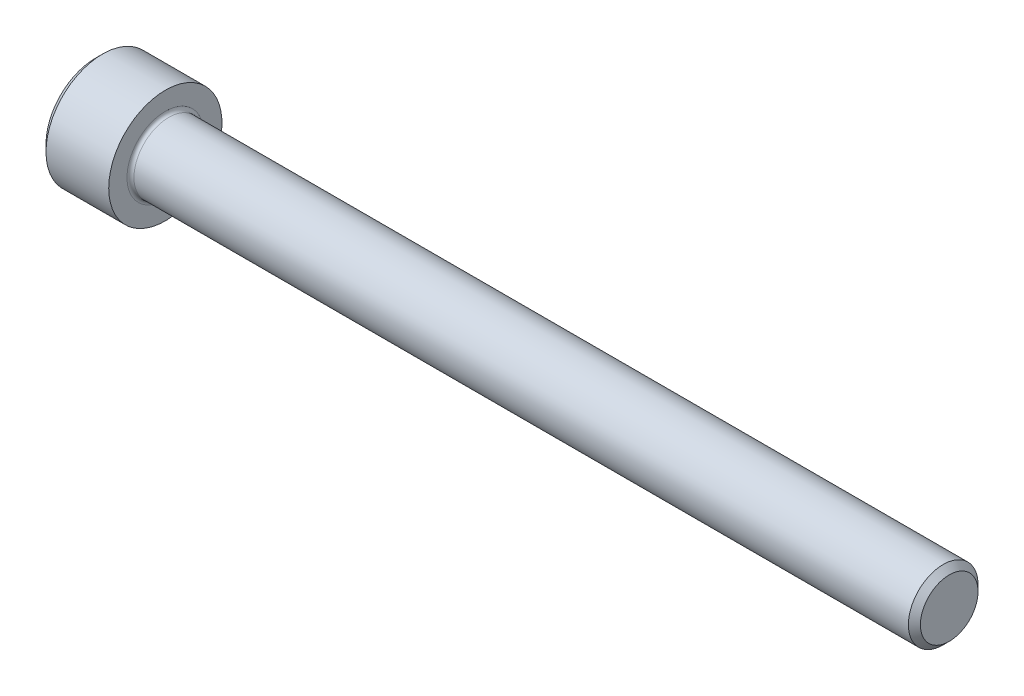
ISO-10303-21;
HEADER;
FILE_DESCRIPTION(('STEP AP214'),'2;1');
FILE_NAME('part.step','',(''),(''),'','','');
FILE_SCHEMA(('AUTOMOTIVE_DESIGN { 1 0 10303 214 1 1 1 1 }'));
ENDSEC;
DATA;
#1=APPLICATION_CONTEXT('core data for automotive mechanical design processes');
#2=APPLICATION_PROTOCOL_DEFINITION('international standard','automotive_design',2000,#1);
#3=PRODUCT_CONTEXT('',#1,'mechanical');
#4=PRODUCT('Part','Part','',(#3));
#5=PRODUCT_RELATED_PRODUCT_CATEGORY('part','',(#4));
#6=PRODUCT_DEFINITION_FORMATION('','',#4);
#7=PRODUCT_DEFINITION_CONTEXT('part definition',#1,'design');
#8=PRODUCT_DEFINITION('design','',#6,#7);
#9=PRODUCT_DEFINITION_SHAPE('','',#8);
#10=(LENGTH_UNIT() NAMED_UNIT(*) SI_UNIT(.MILLI.,.METRE.));
#11=(NAMED_UNIT(*) PLANE_ANGLE_UNIT() SI_UNIT($,.RADIAN.));
#12=(NAMED_UNIT(*) SI_UNIT($,.STERADIAN.) SOLID_ANGLE_UNIT());
#13=UNCERTAINTY_MEASURE_WITH_UNIT(LENGTH_MEASURE(1.E-05),#10,'distance_accuracy_value','');
#14=(GEOMETRIC_REPRESENTATION_CONTEXT(3) GLOBAL_UNCERTAINTY_ASSIGNED_CONTEXT((#13)) GLOBAL_UNIT_ASSIGNED_CONTEXT((#10,
#11,#12)) REPRESENTATION_CONTEXT('',''));
#15=CARTESIAN_POINT('',(0.,0.,0.));
#16=DIRECTION('',(0.,0.,1.));
#17=DIRECTION('',(1.,0.,0.));
#18=AXIS2_PLACEMENT_3D('',#15,#16,#17);
#19=CARTESIAN_POINT('',(0.,0.,0.));
#20=DIRECTION('',(-1.,0.,0.));
#21=DIRECTION('',(0.,0.,1.));
#22=AXIS2_PLACEMENT_3D('',#19,#20,#21);
#23=PLANE('',#22);
#24=DIRECTION('',(0.,-0.499999999999999,0.866025403784439));
#25=VECTOR('',#24,1.);
#26=CARTESIAN_POINT('',(0.,3.51894989071077,0.));
#27=LINE('',#26,#25);
#28=CARTESIAN_POINT('',(0.,3.51894989071077,0.));
#29=VERTEX_POINT('',#28);
#30=CARTESIAN_POINT('',(0.,1.75947494535539,3.0475));
#31=VERTEX_POINT('',#30);
#32=EDGE_CURVE('E290',#29,#31,#27,.T.);
#33=ORIENTED_EDGE('',*,*,#32,.T.);
#34=DIRECTION('',(0.,1.,0.));
#35=VECTOR('',#34,1.);
#36=CARTESIAN_POINT('',(0.,-1.75947494535538,3.0475));
#37=LINE('',#36,#35);
#38=CARTESIAN_POINT('',(0.,-1.75947494535538,3.0475));
#39=VERTEX_POINT('',#38);
#40=EDGE_CURVE('E146',#39,#31,#37,.T.);
#41=ORIENTED_EDGE('',*,*,#40,.F.);
#42=DIRECTION('',(0.,-0.500000000000001,-0.866025403784438));
#43=VECTOR('',#42,1.);
#44=CARTESIAN_POINT('',(0.,-1.75947494535538,3.0475));
#45=LINE('',#44,#43);
#46=CARTESIAN_POINT('',(0.,-3.51894989071077,0.));
#47=VERTEX_POINT('',#46);
#48=EDGE_CURVE('E295',#39,#47,#45,.T.);
#49=ORIENTED_EDGE('',*,*,#48,.T.);
#50=DIRECTION('',(0.,0.499999999999999,-0.866025403784439));
#51=VECTOR('',#50,1.);
#52=CARTESIAN_POINT('',(0.,-3.51894989071077,0.));
#53=LINE('',#52,#51);
#54=CARTESIAN_POINT('',(0.,-1.75947494535539,-3.0475));
#55=VERTEX_POINT('',#54);
#56=EDGE_CURVE('E299',#47,#55,#53,.T.);
#57=ORIENTED_EDGE('',*,*,#56,.T.);
#58=DIRECTION('',(0.,-1.,0.));
#59=VECTOR('',#58,1.);
#60=CARTESIAN_POINT('',(0.,1.75947494535538,-3.0475));
#61=LINE('',#60,#59);
#62=CARTESIAN_POINT('',(0.,1.75947494535538,-3.0475));
#63=VERTEX_POINT('',#62);
#64=EDGE_CURVE('E303',#63,#55,#61,.T.);
#65=ORIENTED_EDGE('',*,*,#64,.F.);
#66=DIRECTION('',(0.,-0.500000000000001,-0.866025403784438));
#67=VECTOR('',#66,1.);
#68=CARTESIAN_POINT('',(0.,3.51894989071077,0.));
#69=LINE('',#68,#67);
#70=EDGE_CURVE('E141',#29,#63,#69,.T.);
#71=ORIENTED_EDGE('',*,*,#70,.F.);
#72=EDGE_LOOP('',(#33,#41,#49,#57,#65,#71));
#73=FACE_BOUND('',#72,.T.);
#74=CARTESIAN_POINT('',(0.,0.,0.));
#75=DIRECTION('',(-1.,0.,0.));
#76=DIRECTION('',(0.,0.,1.));
#77=AXIS2_PLACEMENT_3D('',#74,#75,#76);
#78=CIRCLE('',#77,5.7);
#79=CARTESIAN_POINT('',(0.,0.,5.7));
#80=VERTEX_POINT('',#79);
#81=EDGE_CURVE('E178',#80,#80,#78,.T.);
#82=ORIENTED_EDGE('',*,*,#81,.T.);
#83=EDGE_LOOP('',(#82));
#84=FACE_BOUND('',#83,.T.);
#85=ADVANCED_FACE('F47',(#73,#84),#23,.T.);
#86=CARTESIAN_POINT('',(0.,0.,0.));
#87=DIRECTION('',(1.,0.,0.));
#88=DIRECTION('',(0.,0.,-1.));
#89=AXIS2_PLACEMENT_3D('',#86,#87,#88);
#90=CONICAL_SURFACE('',#89,5.7,0.785398163397449);
#91=CARTESIAN_POINT('',(0.800000000000002,0.,0.));
#92=DIRECTION('',(-1.,0.,0.));
#93=DIRECTION('',(0.,0.,1.));
#94=AXIS2_PLACEMENT_3D('',#91,#92,#93);
#95=CIRCLE('',#94,6.5);
#96=CARTESIAN_POINT('',(0.800000000000002,0.,6.5));
#97=VERTEX_POINT('',#96);
#98=EDGE_CURVE('E174',#97,#97,#95,.T.);
#99=ORIENTED_EDGE('',*,*,#98,.T.);
#100=EDGE_LOOP('',(#99));
#101=FACE_BOUND('',#100,.T.);
#102=ORIENTED_EDGE('',*,*,#81,.F.);
#103=EDGE_LOOP('',(#102));
#104=FACE_BOUND('',#103,.T.);
#105=ADVANCED_FACE('F201',(#101,#104),#90,.T.);
#106=CARTESIAN_POINT('',(-31.75,0.,0.));
#107=DIRECTION('',(-1.,0.,0.));
#108=DIRECTION('',(0.,0.,1.));
#109=AXIS2_PLACEMENT_3D('',#106,#107,#108);
#110=CYLINDRICAL_SURFACE('',#109,6.5);
#111=CARTESIAN_POINT('',(8.,0.,0.));
#112=DIRECTION('',(-1.,0.,0.));
#113=DIRECTION('',(0.,0.,1.));
#114=AXIS2_PLACEMENT_3D('',#111,#112,#113);
#115=CIRCLE('',#114,6.5);
#116=CARTESIAN_POINT('',(8.,0.,6.5));
#117=VERTEX_POINT('',#116);
#118=EDGE_CURVE('E170',#117,#117,#115,.T.);
#119=ORIENTED_EDGE('',*,*,#118,.T.);
#120=EDGE_LOOP('',(#119));
#121=FACE_BOUND('',#120,.T.);
#122=ORIENTED_EDGE('',*,*,#98,.F.);
#123=EDGE_LOOP('',(#122));
#124=FACE_BOUND('',#123,.T.);
#125=ADVANCED_FACE('F206',(#121,#124),#110,.T.);
#126=CARTESIAN_POINT('',(8.,6.5,0.));
#127=DIRECTION('',(1.,0.,0.));
#128=DIRECTION('',(0.,0.,-1.));
#129=AXIS2_PLACEMENT_3D('',#126,#127,#128);
#130=PLANE('',#129);
#131=CARTESIAN_POINT('',(8.,0.,0.));
#132=DIRECTION('',(1.,0.,0.));
#133=DIRECTION('',(0.,0.,-1.));
#134=AXIS2_PLACEMENT_3D('',#131,#132,#133);
#135=CIRCLE('',#134,4.40000000000003);
#136=CARTESIAN_POINT('',(8.,0.,-4.40000000000003));
#137=VERTEX_POINT('',#136);
#138=EDGE_CURVE('E56',#137,#137,#135,.F.);
#139=ORIENTED_EDGE('',*,*,#138,.T.);
#140=EDGE_LOOP('',(#139));
#141=FACE_BOUND('',#140,.T.);
#142=ORIENTED_EDGE('',*,*,#118,.F.);
#143=EDGE_LOOP('',(#142));
#144=FACE_BOUND('',#143,.T.);
#145=ADVANCED_FACE('F185',(#141,#144),#130,.T.);
#146=CARTESIAN_POINT('',(-31.75,0.,0.));
#147=DIRECTION('',(-1.,0.,0.));
#148=DIRECTION('',(0.,0.,1.));
#149=AXIS2_PLACEMENT_3D('',#146,#147,#148);
#150=CYLINDRICAL_SURFACE('',#149,4.00000000000003);
#151=CARTESIAN_POINT('',(8.4,0.,0.));
#152=DIRECTION('',(1.,0.,0.));
#153=DIRECTION('',(0.,0.,-1.));
#154=AXIS2_PLACEMENT_3D('',#151,#152,#153);
#155=CIRCLE('',#154,4.00000000000003);
#156=CARTESIAN_POINT('',(8.4,0.,-4.00000000000003));
#157=VERTEX_POINT('',#156);
#158=EDGE_CURVE('E11',#157,#157,#155,.T.);
#159=ORIENTED_EDGE('',*,*,#158,.T.);
#160=EDGE_LOOP('',(#159));
#161=FACE_BOUND('',#160,.T.);
#162=CARTESIAN_POINT('',(97.3095000000001,0.,0.));
#163=DIRECTION('',(-1.,0.,0.));
#164=DIRECTION('',(0.,0.,1.));
#165=AXIS2_PLACEMENT_3D('',#162,#163,#164);
#166=CIRCLE('',#165,4.00000000000007);
#167=CARTESIAN_POINT('',(97.3095000000001,0.,4.00000000000007));
#168=VERTEX_POINT('',#167);
#169=EDGE_CURVE('E166',#168,#168,#166,.T.);
#170=ORIENTED_EDGE('',*,*,#169,.T.);
#171=EDGE_LOOP('',(#170));
#172=FACE_BOUND('',#171,.T.);
#173=ADVANCED_FACE('F216',(#161,#172),#150,.T.);
#174=CARTESIAN_POINT('',(98.,0.,0.));
#175=DIRECTION('',(-1.,0.,0.));
#176=DIRECTION('',(0.,0.,1.));
#177=AXIS2_PLACEMENT_3D('',#174,#175,#176);
#178=CONICAL_SURFACE('',#177,3.3095,0.785398163397549);
#179=ORIENTED_EDGE('',*,*,#169,.F.);
#180=EDGE_LOOP('',(#179));
#181=FACE_BOUND('',#180,.T.);
#182=CARTESIAN_POINT('',(98.,0.,0.));
#183=DIRECTION('',(-1.,0.,0.));
#184=DIRECTION('',(0.,0.,1.));
#185=AXIS2_PLACEMENT_3D('',#182,#183,#184);
#186=CIRCLE('',#185,3.3095);
#187=CARTESIAN_POINT('',(98.,0.,3.3095));
#188=VERTEX_POINT('',#187);
#189=EDGE_CURVE('E161',#188,#188,#186,.T.);
#190=ORIENTED_EDGE('',*,*,#189,.T.);
#191=EDGE_LOOP('',(#190));
#192=FACE_BOUND('',#191,.T.);
#193=ADVANCED_FACE('F196',(#181,#192),#178,.T.);
#194=CARTESIAN_POINT('',(98.,3.3095,0.));
#195=DIRECTION('',(1.,0.,0.));
#196=DIRECTION('',(0.,0.,-1.));
#197=AXIS2_PLACEMENT_3D('',#194,#195,#196);
#198=PLANE('',#197);
#199=ORIENTED_EDGE('',*,*,#189,.F.);
#200=EDGE_LOOP('',(#199));
#201=FACE_BOUND('',#200,.T.);
#202=ADVANCED_FACE('F189',(#201),#198,.T.);
#203=CARTESIAN_POINT('',(8.4,0.,0.));
#204=DIRECTION('',(1.,0.,0.));
#205=DIRECTION('',(0.,0.,-1.));
#206=AXIS2_PLACEMENT_3D('',#203,#204,#205);
#207=TOROIDAL_SURFACE('',#206,4.40000000000003,0.4);
#208=ORIENTED_EDGE('',*,*,#158,.F.);
#209=EDGE_LOOP('',(#208));
#210=FACE_BOUND('',#209,.T.);
#211=ORIENTED_EDGE('',*,*,#138,.F.);
#212=EDGE_LOOP('',(#211));
#213=FACE_BOUND('',#212,.T.);
#214=ADVANCED_FACE('F49',(#210,#213),#207,.F.);
#215=CARTESIAN_POINT('',(4.,3.51894989071077,0.));
#216=DIRECTION('',(0.,-0.866025403784439,-0.499999999999999));
#217=DIRECTION('',(0.,0.499999999999999,-0.866025403784439));
#218=AXIS2_PLACEMENT_3D('',#215,#216,#217);
#219=PLANE('',#218);
#220=ORIENTED_EDGE('',*,*,#32,.F.);
#221=DIRECTION('',(-1.,0.,0.));
#222=VECTOR('',#221,1.);
#223=CARTESIAN_POINT('',(4.,3.51894989071077,0.));
#224=LINE('',#223,#222);
#225=CARTESIAN_POINT('',(4.,3.51894989071077,0.));
#226=VERTEX_POINT('',#225);
#227=EDGE_CURVE('E277',#226,#29,#224,.T.);
#228=ORIENTED_EDGE('',*,*,#227,.F.);
#229=DIRECTION('',(0.,-0.499999999999999,0.866025403784439));
#230=VECTOR('',#229,1.);
#231=CARTESIAN_POINT('',(4.,3.51894989071077,0.));
#232=LINE('',#231,#230);
#233=CARTESIAN_POINT('',(4.,2.63921241803308,1.52375));
#234=VERTEX_POINT('',#233);
#235=EDGE_CURVE('E132',#226,#234,#232,.T.);
#236=ORIENTED_EDGE('',*,*,#235,.T.);
#237=CARTESIAN_POINT('',(4.,1.75947494535539,3.0475));
#238=VERTEX_POINT('',#237);
#239=EDGE_CURVE('E122',#234,#238,#232,.T.);
#240=ORIENTED_EDGE('',*,*,#239,.T.);
#241=DIRECTION('',(-1.,0.,0.));
#242=VECTOR('',#241,1.);
#243=CARTESIAN_POINT('',(4.,1.75947494535539,3.0475));
#244=LINE('',#243,#242);
#245=EDGE_CURVE('E137',#238,#31,#244,.T.);
#246=ORIENTED_EDGE('',*,*,#245,.T.);
#247=EDGE_LOOP('',(#220,#228,#236,#240,#246));
#248=FACE_BOUND('',#247,.T.);
#249=ADVANCED_FACE('F136',(#248),#219,.T.);
#250=CARTESIAN_POINT('',(4.,-1.75947494535538,3.0475));
#251=DIRECTION('',(0.,0.,1.));
#252=DIRECTION('',(0.,-1.,0.));
#253=AXIS2_PLACEMENT_3D('',#250,#251,#252);
#254=PLANE('',#253);
#255=ORIENTED_EDGE('',*,*,#40,.T.);
#256=ORIENTED_EDGE('',*,*,#245,.F.);
#257=DIRECTION('',(0.,1.,0.));
#258=VECTOR('',#257,1.);
#259=CARTESIAN_POINT('',(4.,-1.75947494535538,3.0475));
#260=LINE('',#259,#258);
#261=CARTESIAN_POINT('',(4.,0.,3.0475));
#262=VERTEX_POINT('',#261);
#263=EDGE_CURVE('E119',#262,#238,#260,.T.);
#264=ORIENTED_EDGE('',*,*,#263,.F.);
#265=CARTESIAN_POINT('',(4.,-1.75947494535538,3.0475));
#266=VERTEX_POINT('',#265);
#267=EDGE_CURVE('E131',#266,#262,#260,.T.);
#268=ORIENTED_EDGE('',*,*,#267,.F.);
#269=DIRECTION('',(-1.,0.,0.));
#270=VECTOR('',#269,1.);
#271=CARTESIAN_POINT('',(4.,-1.75947494535538,3.0475));
#272=LINE('',#271,#270);
#273=EDGE_CURVE('E149',#266,#39,#272,.T.);
#274=ORIENTED_EDGE('',*,*,#273,.T.);
#275=EDGE_LOOP('',(#255,#256,#264,#268,#274));
#276=FACE_BOUND('',#275,.T.);
#277=ADVANCED_FACE('F143',(#276),#254,.F.);
#278=CARTESIAN_POINT('',(4.,-1.75947494535538,3.0475));
#279=DIRECTION('',(0.,0.866025403784438,-0.500000000000001));
#280=DIRECTION('',(0.,0.500000000000001,0.866025403784438));
#281=AXIS2_PLACEMENT_3D('',#278,#279,#280);
#282=PLANE('',#281);
#283=ORIENTED_EDGE('',*,*,#48,.F.);
#284=ORIENTED_EDGE('',*,*,#273,.F.);
#285=DIRECTION('',(0.,-0.500000000000001,-0.866025403784438));
#286=VECTOR('',#285,1.);
#287=CARTESIAN_POINT('',(4.,-1.75947494535538,3.0475));
#288=LINE('',#287,#286);
#289=CARTESIAN_POINT('',(4.,-2.63921241803307,1.52375));
#290=VERTEX_POINT('',#289);
#291=EDGE_CURVE('E333',#266,#290,#288,.T.);
#292=ORIENTED_EDGE('',*,*,#291,.T.);
#293=CARTESIAN_POINT('',(4.,-3.51894989071077,0.));
#294=VERTEX_POINT('',#293);
#295=EDGE_CURVE('E317',#290,#294,#288,.T.);
#296=ORIENTED_EDGE('',*,*,#295,.T.);
#297=DIRECTION('',(-1.,0.,0.));
#298=VECTOR('',#297,1.);
#299=CARTESIAN_POINT('',(4.,-3.51894989071077,0.));
#300=LINE('',#299,#298);
#301=EDGE_CURVE('E156',#294,#47,#300,.T.);
#302=ORIENTED_EDGE('',*,*,#301,.T.);
#303=EDGE_LOOP('',(#283,#284,#292,#296,#302));
#304=FACE_BOUND('',#303,.T.);
#305=ADVANCED_FACE('F229',(#304),#282,.T.);
#306=CARTESIAN_POINT('',(4.,-3.51894989071077,0.));
#307=DIRECTION('',(0.,0.866025403784439,0.499999999999999));
#308=DIRECTION('',(0.,-0.499999999999999,0.866025403784439));
#309=AXIS2_PLACEMENT_3D('',#306,#307,#308);
#310=PLANE('',#309);
#311=ORIENTED_EDGE('',*,*,#56,.F.);
#312=ORIENTED_EDGE('',*,*,#301,.F.);
#313=DIRECTION('',(0.,0.499999999999999,-0.866025403784439));
#314=VECTOR('',#313,1.);
#315=CARTESIAN_POINT('',(4.,-3.51894989071077,0.));
#316=LINE('',#315,#314);
#317=CARTESIAN_POINT('',(4.,-2.63921241803308,-1.52375));
#318=VERTEX_POINT('',#317);
#319=EDGE_CURVE('E285',#294,#318,#316,.T.);
#320=ORIENTED_EDGE('',*,*,#319,.T.);
#321=CARTESIAN_POINT('',(4.,-1.75947494535539,-3.0475));
#322=VERTEX_POINT('',#321);
#323=EDGE_CURVE('E331',#318,#322,#316,.T.);
#324=ORIENTED_EDGE('',*,*,#323,.T.);
#325=DIRECTION('',(-1.,0.,0.));
#326=VECTOR('',#325,1.);
#327=CARTESIAN_POINT('',(4.,-1.75947494535539,-3.0475));
#328=LINE('',#327,#326);
#329=EDGE_CURVE('E276',#322,#55,#328,.T.);
#330=ORIENTED_EDGE('',*,*,#329,.T.);
#331=EDGE_LOOP('',(#311,#312,#320,#324,#330));
#332=FACE_BOUND('',#331,.T.);
#333=ADVANCED_FACE('F232',(#332),#310,.T.);
#334=CARTESIAN_POINT('',(4.,1.75947494535538,-3.0475));
#335=DIRECTION('',(0.,0.,-1.));
#336=DIRECTION('',(0.,1.,0.));
#337=AXIS2_PLACEMENT_3D('',#334,#335,#336);
#338=PLANE('',#337);
#339=ORIENTED_EDGE('',*,*,#64,.T.);
#340=ORIENTED_EDGE('',*,*,#329,.F.);
#341=DIRECTION('',(0.,-1.,0.));
#342=VECTOR('',#341,1.);
#343=CARTESIAN_POINT('',(4.,1.75947494535538,-3.0475));
#344=LINE('',#343,#342);
#345=CARTESIAN_POINT('',(4.,0.,-3.0475));
#346=VERTEX_POINT('',#345);
#347=EDGE_CURVE('E280',#346,#322,#344,.T.);
#348=ORIENTED_EDGE('',*,*,#347,.F.);
#349=CARTESIAN_POINT('',(4.,1.75947494535538,-3.0475));
#350=VERTEX_POINT('',#349);
#351=EDGE_CURVE('E63',#350,#346,#344,.T.);
#352=ORIENTED_EDGE('',*,*,#351,.F.);
#353=DIRECTION('',(-1.,0.,0.));
#354=VECTOR('',#353,1.);
#355=CARTESIAN_POINT('',(4.,1.75947494535538,-3.0475));
#356=LINE('',#355,#354);
#357=EDGE_CURVE('E272',#350,#63,#356,.T.);
#358=ORIENTED_EDGE('',*,*,#357,.T.);
#359=EDGE_LOOP('',(#339,#340,#348,#352,#358));
#360=FACE_BOUND('',#359,.T.);
#361=ADVANCED_FACE('F236',(#360),#338,.F.);
#362=CARTESIAN_POINT('',(4.,3.51894989071077,0.));
#363=DIRECTION('',(0.,0.866025403784438,-0.500000000000001));
#364=DIRECTION('',(0.,0.500000000000001,0.866025403784438));
#365=AXIS2_PLACEMENT_3D('',#362,#363,#364);
#366=PLANE('',#365);
#367=ORIENTED_EDGE('',*,*,#70,.T.);
#368=ORIENTED_EDGE('',*,*,#357,.F.);
#369=DIRECTION('',(0.,-0.500000000000001,-0.866025403784438));
#370=VECTOR('',#369,1.);
#371=CARTESIAN_POINT('',(4.,3.51894989071077,0.));
#372=LINE('',#371,#370);
#373=CARTESIAN_POINT('',(4.,2.63921241803307,-1.52375));
#374=VERTEX_POINT('',#373);
#375=EDGE_CURVE('E261',#374,#350,#372,.T.);
#376=ORIENTED_EDGE('',*,*,#375,.F.);
#377=EDGE_CURVE('E268',#226,#374,#372,.T.);
#378=ORIENTED_EDGE('',*,*,#377,.F.);
#379=ORIENTED_EDGE('',*,*,#227,.T.);
#380=EDGE_LOOP('',(#367,#368,#376,#378,#379));
#381=FACE_BOUND('',#380,.T.);
#382=ADVANCED_FACE('F240',(#381),#366,.F.);
#383=CARTESIAN_POINT('',(4.,3.51894989071077,0.));
#384=DIRECTION('',(1.,0.,0.));
#385=DIRECTION('',(0.,0.,-1.));
#386=AXIS2_PLACEMENT_3D('',#383,#384,#385);
#387=PLANE('',#386);
#388=ORIENTED_EDGE('',*,*,#347,.T.);
#389=ORIENTED_EDGE('',*,*,#323,.F.);
#390=CARTESIAN_POINT('',(4.,0.,0.));
#391=DIRECTION('',(-1.,0.,0.));
#392=DIRECTION('',(0.,0.,1.));
#393=AXIS2_PLACEMENT_3D('',#390,#391,#392);
#394=CIRCLE('',#393,3.0475);
#395=EDGE_CURVE('E325',#346,#318,#394,.T.);
#396=ORIENTED_EDGE('',*,*,#395,.F.);
#397=EDGE_LOOP('',(#388,#389,#396));
#398=FACE_BOUND('',#397,.T.);
#399=ADVANCED_FACE('F244',(#398),#387,.F.);
#400=ORIENTED_EDGE('',*,*,#319,.F.);
#401=ORIENTED_EDGE('',*,*,#295,.F.);
#402=EDGE_CURVE('E154',#318,#290,#394,.T.);
#403=ORIENTED_EDGE('',*,*,#402,.F.);
#404=EDGE_LOOP('',(#400,#401,#403));
#405=FACE_BOUND('',#404,.T.);
#406=ADVANCED_FACE('F247',(#405),#387,.F.);
#407=ORIENTED_EDGE('',*,*,#291,.F.);
#408=ORIENTED_EDGE('',*,*,#267,.T.);
#409=EDGE_CURVE('E148',#290,#262,#394,.T.);
#410=ORIENTED_EDGE('',*,*,#409,.F.);
#411=EDGE_LOOP('',(#407,#408,#410));
#412=FACE_BOUND('',#411,.T.);
#413=ADVANCED_FACE('F252',(#412),#387,.F.);
#414=ORIENTED_EDGE('',*,*,#263,.T.);
#415=ORIENTED_EDGE('',*,*,#239,.F.);
#416=EDGE_CURVE('E125',#262,#234,#394,.T.);
#417=ORIENTED_EDGE('',*,*,#416,.F.);
#418=EDGE_LOOP('',(#414,#415,#417));
#419=FACE_BOUND('',#418,.T.);
#420=ADVANCED_FACE('F121',(#419),#387,.F.);
#421=ORIENTED_EDGE('',*,*,#235,.F.);
#422=ORIENTED_EDGE('',*,*,#377,.T.);
#423=EDGE_CURVE('E162',#234,#374,#394,.T.);
#424=ORIENTED_EDGE('',*,*,#423,.F.);
#425=EDGE_LOOP('',(#421,#422,#424));
#426=FACE_BOUND('',#425,.T.);
#427=ADVANCED_FACE('F255',(#426),#387,.F.);
#428=ORIENTED_EDGE('',*,*,#375,.T.);
#429=ORIENTED_EDGE('',*,*,#351,.T.);
#430=EDGE_CURVE('E264',#374,#346,#394,.T.);
#431=ORIENTED_EDGE('',*,*,#430,.F.);
#432=EDGE_LOOP('',(#428,#429,#431));
#433=FACE_BOUND('',#432,.T.);
#434=ADVANCED_FACE('F225',(#433),#387,.F.);
#435=CARTESIAN_POINT('',(4.,0.,0.));
#436=DIRECTION('',(-1.,0.,0.));
#437=DIRECTION('',(0.,0.,1.));
#438=AXIS2_PLACEMENT_3D('',#435,#436,#437);
#439=CONICAL_SURFACE('',#438,3.0475,1.04719755119659);
#440=CARTESIAN_POINT('',(5.75947494535541,0.,0.));
#441=VERTEX_POINT('',#440);
#442=VERTEX_LOOP('',#441);
#443=FACE_BOUND('',#442,.T.);
#444=ORIENTED_EDGE('',*,*,#416,.T.);
#445=ORIENTED_EDGE('',*,*,#423,.T.);
#446=ORIENTED_EDGE('',*,*,#430,.T.);
#447=ORIENTED_EDGE('',*,*,#395,.T.);
#448=ORIENTED_EDGE('',*,*,#402,.T.);
#449=ORIENTED_EDGE('',*,*,#409,.T.);
#450=EDGE_LOOP('',(#444,#445,#446,#447,#448,#449));
#451=FACE_BOUND('',#450,.T.);
#452=ADVANCED_FACE('F223',(#443,#451),#439,.F.);
#453=CLOSED_SHELL('',(#85,#105,#125,#145,#173,#193,#202,#214,#249,#277,#305,#333,#361,#382,#399,
#406,#413,#420,#427,#434,#452));
#454=MANIFOLD_SOLID_BREP('B2',#453);
#455=ADVANCED_BREP_SHAPE_REPRESENTATION('',(#18,#454),#14);
#456=SHAPE_DEFINITION_REPRESENTATION(#9,#455);
ENDSEC;
END-ISO-10303-21;
